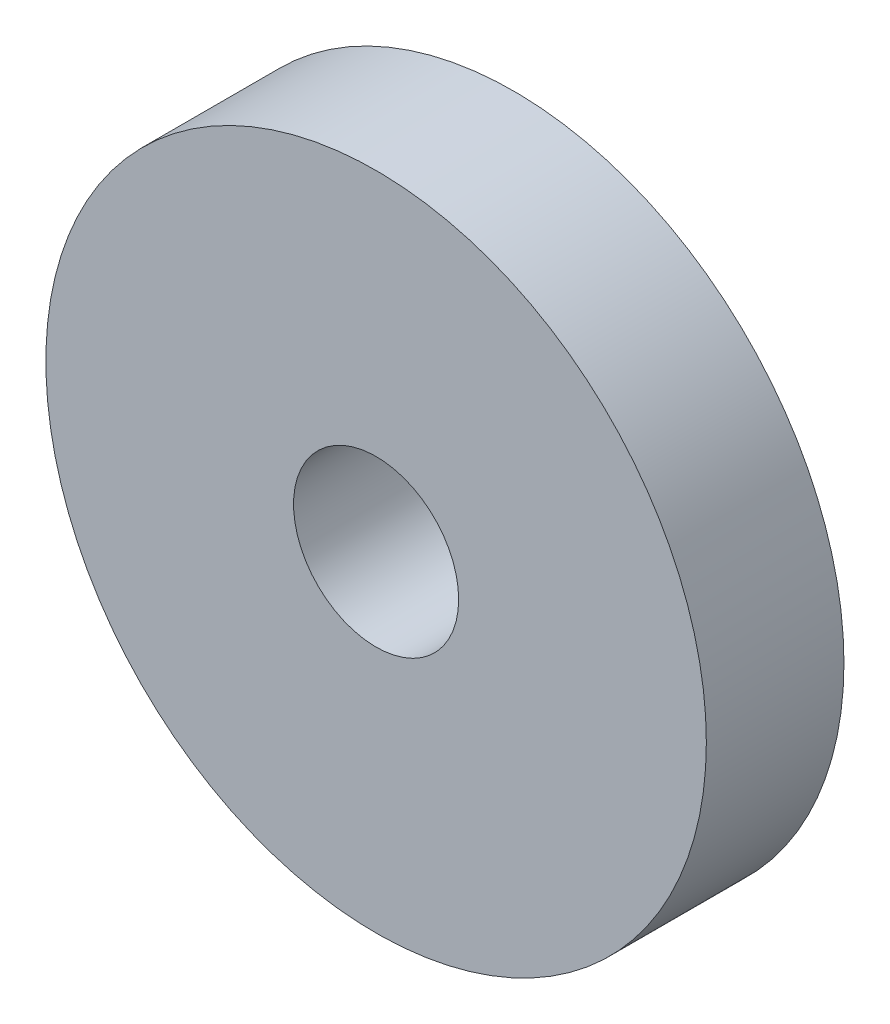
ISO-10303-21;
HEADER;
FILE_DESCRIPTION(('STEP AP214'),'2;1');
FILE_NAME('part.step','',(''),(''),'','','');
FILE_SCHEMA(('AUTOMOTIVE_DESIGN { 1 0 10303 214 1 1 1 1 }'));
ENDSEC;
DATA;
#1=APPLICATION_CONTEXT('core data for automotive mechanical design processes');
#2=APPLICATION_PROTOCOL_DEFINITION('international standard','automotive_design',2000,#1);
#3=PRODUCT_CONTEXT('',#1,'mechanical');
#4=PRODUCT('Part','Part','',(#3));
#5=PRODUCT_RELATED_PRODUCT_CATEGORY('part','',(#4));
#6=PRODUCT_DEFINITION_FORMATION('','',#4);
#7=PRODUCT_DEFINITION_CONTEXT('part definition',#1,'design');
#8=PRODUCT_DEFINITION('design','',#6,#7);
#9=PRODUCT_DEFINITION_SHAPE('','',#8);
#10=(LENGTH_UNIT() NAMED_UNIT(*) SI_UNIT(.MILLI.,.METRE.));
#11=(NAMED_UNIT(*) PLANE_ANGLE_UNIT() SI_UNIT($,.RADIAN.));
#12=(NAMED_UNIT(*) SI_UNIT($,.STERADIAN.) SOLID_ANGLE_UNIT());
#13=UNCERTAINTY_MEASURE_WITH_UNIT(LENGTH_MEASURE(1.E-05),#10,'distance_accuracy_value','');
#14=(GEOMETRIC_REPRESENTATION_CONTEXT(3) GLOBAL_UNCERTAINTY_ASSIGNED_CONTEXT((#13)) GLOBAL_UNIT_ASSIGNED_CONTEXT((#10,
#11,#12)) REPRESENTATION_CONTEXT('',''));
#15=CARTESIAN_POINT('',(0.,0.,0.));
#16=DIRECTION('',(0.,0.,1.));
#17=DIRECTION('',(1.,0.,0.));
#18=AXIS2_PLACEMENT_3D('',#15,#16,#17);
#19=CARTESIAN_POINT('',(0.,0.,5.));
#20=DIRECTION('',(0.,0.,1.));
#21=DIRECTION('',(1.,0.,0.));
#22=AXIS2_PLACEMENT_3D('',#19,#20,#21);
#23=PLANE('',#22);
#24=CARTESIAN_POINT('',(0.,0.,5.));
#25=DIRECTION('',(0.,0.,1.));
#26=DIRECTION('',(1.,0.,0.));
#27=AXIS2_PLACEMENT_3D('',#24,#25,#26);
#28=CIRCLE('',#27,12.);
#29=CARTESIAN_POINT('',(12.,0.,5.));
#30=VERTEX_POINT('',#29);
#31=EDGE_CURVE('E10',#30,#30,#28,.T.);
#32=ORIENTED_EDGE('',*,*,#31,.T.);
#33=EDGE_LOOP('',(#32));
#34=FACE_BOUND('',#33,.T.);
#35=CARTESIAN_POINT('',(0.,0.,5.));
#36=DIRECTION('',(0.,0.,1.));
#37=DIRECTION('',(1.,0.,0.));
#38=AXIS2_PLACEMENT_3D('',#35,#36,#37);
#39=CIRCLE('',#38,3.);
#40=CARTESIAN_POINT('',(3.,0.,5.));
#41=VERTEX_POINT('',#40);
#42=EDGE_CURVE('E56',#41,#41,#39,.T.);
#43=ORIENTED_EDGE('',*,*,#42,.F.);
#44=EDGE_LOOP('',(#43));
#45=FACE_BOUND('',#44,.T.);
#46=ADVANCED_FACE('F43',(#34,#45),#23,.T.);
#47=CARTESIAN_POINT('',(0.,0.,0.));
#48=DIRECTION('',(0.,0.,1.));
#49=DIRECTION('',(1.,0.,0.));
#50=AXIS2_PLACEMENT_3D('',#47,#48,#49);
#51=PLANE('',#50);
#52=CARTESIAN_POINT('',(0.,0.,0.));
#53=DIRECTION('',(0.,0.,1.));
#54=DIRECTION('',(1.,0.,0.));
#55=AXIS2_PLACEMENT_3D('',#52,#53,#54);
#56=CIRCLE('',#55,12.);
#57=CARTESIAN_POINT('',(12.,0.,0.));
#58=VERTEX_POINT('',#57);
#59=EDGE_CURVE('E47',#58,#58,#56,.T.);
#60=ORIENTED_EDGE('',*,*,#59,.F.);
#61=EDGE_LOOP('',(#60));
#62=FACE_BOUND('',#61,.T.);
#63=CARTESIAN_POINT('',(0.,0.,0.));
#64=DIRECTION('',(0.,0.,1.));
#65=DIRECTION('',(1.,0.,0.));
#66=AXIS2_PLACEMENT_3D('',#63,#64,#65);
#67=CIRCLE('',#66,3.);
#68=CARTESIAN_POINT('',(3.,0.,0.));
#69=VERTEX_POINT('',#68);
#70=EDGE_CURVE('E58',#69,#69,#67,.T.);
#71=ORIENTED_EDGE('',*,*,#70,.T.);
#72=EDGE_LOOP('',(#71));
#73=FACE_BOUND('',#72,.T.);
#74=ADVANCED_FACE('F70',(#62,#73),#51,.F.);
#75=CARTESIAN_POINT('',(0.,0.,5.));
#76=DIRECTION('',(0.,0.,-1.));
#77=DIRECTION('',(-1.,0.,0.));
#78=AXIS2_PLACEMENT_3D('',#75,#76,#77);
#79=CYLINDRICAL_SURFACE('',#78,12.);
#80=ORIENTED_EDGE('',*,*,#31,.F.);
#81=EDGE_LOOP('',(#80));
#82=FACE_BOUND('',#81,.T.);
#83=ORIENTED_EDGE('',*,*,#59,.T.);
#84=EDGE_LOOP('',(#83));
#85=FACE_BOUND('',#84,.T.);
#86=ADVANCED_FACE('F45',(#82,#85),#79,.T.);
#87=CARTESIAN_POINT('',(0.,0.,5.));
#88=DIRECTION('',(0.,0.,-1.));
#89=DIRECTION('',(-1.,0.,0.));
#90=AXIS2_PLACEMENT_3D('',#87,#88,#89);
#91=CYLINDRICAL_SURFACE('',#90,3.);
#92=ORIENTED_EDGE('',*,*,#42,.T.);
#93=EDGE_LOOP('',(#92));
#94=FACE_BOUND('',#93,.T.);
#95=ORIENTED_EDGE('',*,*,#70,.F.);
#96=EDGE_LOOP('',(#95));
#97=FACE_BOUND('',#96,.T.);
#98=ADVANCED_FACE('F66',(#94,#97),#91,.F.);
#99=CLOSED_SHELL('',(#46,#74,#86,#98));
#100=MANIFOLD_SOLID_BREP('B2',#99);
#101=ADVANCED_BREP_SHAPE_REPRESENTATION('',(#18,#100),#14);
#102=SHAPE_DEFINITION_REPRESENTATION(#9,#101);
ENDSEC;
END-ISO-10303-21;
